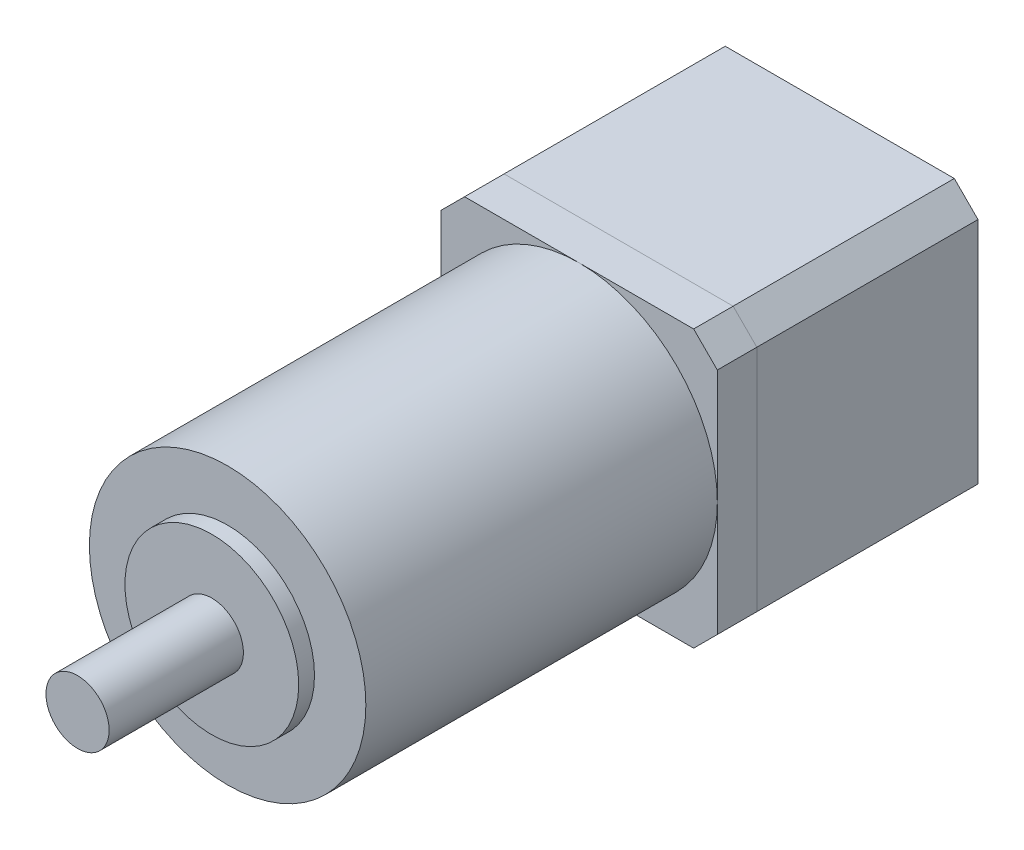
ISO-10303-21;
HEADER;
FILE_DESCRIPTION(('STEP AP214'),'2;1');
FILE_NAME('part.step','',(''),(''),'','','');
FILE_SCHEMA(('AUTOMOTIVE_DESIGN { 1 0 10303 214 1 1 1 1 }'));
ENDSEC;
DATA;
#1=APPLICATION_CONTEXT('core data for automotive mechanical design processes');
#2=APPLICATION_PROTOCOL_DEFINITION('international standard','automotive_design',2000,#1);
#3=PRODUCT_CONTEXT('',#1,'mechanical');
#4=PRODUCT('Part','Part','',(#3));
#5=PRODUCT_RELATED_PRODUCT_CATEGORY('part','',(#4));
#6=PRODUCT_DEFINITION_FORMATION('','',#4);
#7=PRODUCT_DEFINITION_CONTEXT('part definition',#1,'design');
#8=PRODUCT_DEFINITION('design','',#6,#7);
#9=PRODUCT_DEFINITION_SHAPE('','',#8);
#10=(LENGTH_UNIT() NAMED_UNIT(*) SI_UNIT(.MILLI.,.METRE.));
#11=(NAMED_UNIT(*) PLANE_ANGLE_UNIT() SI_UNIT($,.RADIAN.));
#12=(NAMED_UNIT(*) SI_UNIT($,.STERADIAN.) SOLID_ANGLE_UNIT());
#13=UNCERTAINTY_MEASURE_WITH_UNIT(LENGTH_MEASURE(1.E-05),#10,'distance_accuracy_value','');
#14=(GEOMETRIC_REPRESENTATION_CONTEXT(3) GLOBAL_UNCERTAINTY_ASSIGNED_CONTEXT((#13)) GLOBAL_UNIT_ASSIGNED_CONTEXT((#10,
#11,#12)) REPRESENTATION_CONTEXT('',''));
#15=CARTESIAN_POINT('',(0.,0.,0.));
#16=DIRECTION('',(0.,0.,1.));
#17=DIRECTION('',(1.,0.,0.));
#18=AXIS2_PLACEMENT_3D('',#15,#16,#17);
#19=CARTESIAN_POINT('',(0.,0.,96.5));
#20=DIRECTION('',(0.,0.,-1.));
#21=DIRECTION('',(-1.,0.,0.));
#22=AXIS2_PLACEMENT_3D('',#19,#20,#21);
#23=CYLINDRICAL_SURFACE('',#22,4.);
#24=CARTESIAN_POINT('',(0.,0.,96.5));
#25=DIRECTION('',(0.,0.,1.));
#26=DIRECTION('',(1.,0.,0.));
#27=AXIS2_PLACEMENT_3D('',#24,#25,#26);
#28=CIRCLE('',#27,4.);
#29=CARTESIAN_POINT('',(4.,0.,96.5));
#30=VERTEX_POINT('',#29);
#31=EDGE_CURVE('E11',#30,#30,#28,.T.);
#32=ORIENTED_EDGE('',*,*,#31,.F.);
#33=EDGE_LOOP('',(#32));
#34=FACE_BOUND('',#33,.T.);
#35=CARTESIAN_POINT('',(0.,0.,79.5));
#36=DIRECTION('',(0.,0.,1.));
#37=DIRECTION('',(1.,0.,0.));
#38=AXIS2_PLACEMENT_3D('',#35,#36,#37);
#39=CIRCLE('',#38,4.);
#40=CARTESIAN_POINT('',(4.,0.,79.5));
#41=VERTEX_POINT('',#40);
#42=EDGE_CURVE('E48',#41,#41,#39,.T.);
#43=ORIENTED_EDGE('',*,*,#42,.T.);
#44=EDGE_LOOP('',(#43));
#45=FACE_BOUND('',#44,.T.);
#46=ADVANCED_FACE('F45',(#34,#45),#23,.T.);
#47=CARTESIAN_POINT('',(0.,0.,96.5));
#48=DIRECTION('',(0.,0.,1.));
#49=DIRECTION('',(1.,0.,0.));
#50=AXIS2_PLACEMENT_3D('',#47,#48,#49);
#51=PLANE('',#50);
#52=ORIENTED_EDGE('',*,*,#31,.T.);
#53=EDGE_LOOP('',(#52));
#54=FACE_BOUND('',#53,.T.);
#55=ADVANCED_FACE('F60',(#54),#51,.T.);
#56=CARTESIAN_POINT('',(0.,0.,79.5));
#57=DIRECTION('',(0.,0.,1.));
#58=DIRECTION('',(1.,0.,0.));
#59=AXIS2_PLACEMENT_3D('',#56,#57,#58);
#60=PLANE('',#59);
#61=ORIENTED_EDGE('',*,*,#42,.F.);
#62=EDGE_LOOP('',(#61));
#63=FACE_BOUND('',#62,.T.);
#64=ADVANCED_FACE('F58',(#63),#60,.F.);
#65=CLOSED_SHELL('',(#46,#55,#64));
#66=MANIFOLD_SOLID_BREP('B2',#65);
#67=CARTESIAN_POINT('',(0.,0.,77.5));
#68=DIRECTION('',(0.,0.,-1.));
#69=DIRECTION('',(-1.,0.,0.));
#70=AXIS2_PLACEMENT_3D('',#67,#68,#69);
#71=CYLINDRICAL_SURFACE('',#70,17.5);
#72=CARTESIAN_POINT('',(0.,0.,77.5));
#73=DIRECTION('',(0.,0.,1.));
#74=DIRECTION('',(1.,0.,0.));
#75=AXIS2_PLACEMENT_3D('',#72,#73,#74);
#76=CIRCLE('',#75,17.5);
#77=CARTESIAN_POINT('',(17.5,0.,77.5));
#78=VERTEX_POINT('',#77);
#79=EDGE_CURVE('E102',#78,#78,#76,.T.);
#80=ORIENTED_EDGE('',*,*,#79,.F.);
#81=EDGE_LOOP('',(#80));
#82=FACE_BOUND('',#81,.T.);
#83=CARTESIAN_POINT('',(0.,0.,33.));
#84=DIRECTION('',(0.,0.,1.));
#85=DIRECTION('',(1.,0.,0.));
#86=AXIS2_PLACEMENT_3D('',#83,#84,#85);
#87=CIRCLE('',#86,17.5);
#88=CARTESIAN_POINT('',(17.5,0.,33.));
#89=VERTEX_POINT('',#88);
#90=EDGE_CURVE('E98',#89,#89,#87,.T.);
#91=ORIENTED_EDGE('',*,*,#90,.T.);
#92=EDGE_LOOP('',(#91));
#93=FACE_BOUND('',#92,.T.);
#94=ADVANCED_FACE('F95',(#82,#93),#71,.T.);
#95=CARTESIAN_POINT('',(0.,0.,77.5));
#96=DIRECTION('',(0.,0.,1.));
#97=DIRECTION('',(1.,0.,0.));
#98=AXIS2_PLACEMENT_3D('',#95,#96,#97);
#99=PLANE('',#98);
#100=CARTESIAN_POINT('',(0.,0.,77.5));
#101=DIRECTION('',(0.,0.,1.));
#102=DIRECTION('',(1.,0.,0.));
#103=AXIS2_PLACEMENT_3D('',#100,#101,#102);
#104=CIRCLE('',#103,11.);
#105=CARTESIAN_POINT('',(11.,0.,77.5));
#106=VERTEX_POINT('',#105);
#107=EDGE_CURVE('E44',#106,#106,#104,.T.);
#108=ORIENTED_EDGE('',*,*,#107,.F.);
#109=EDGE_LOOP('',(#108));
#110=FACE_BOUND('',#109,.T.);
#111=ORIENTED_EDGE('',*,*,#79,.T.);
#112=EDGE_LOOP('',(#111));
#113=FACE_BOUND('',#112,.T.);
#114=ADVANCED_FACE('F119',(#110,#113),#99,.T.);
#115=CARTESIAN_POINT('',(0.,0.,33.));
#116=DIRECTION('',(0.,0.,1.));
#117=DIRECTION('',(1.,0.,0.));
#118=AXIS2_PLACEMENT_3D('',#115,#116,#117);
#119=PLANE('',#118);
#120=ORIENTED_EDGE('',*,*,#90,.F.);
#121=EDGE_LOOP('',(#120));
#122=FACE_BOUND('',#121,.T.);
#123=ADVANCED_FACE('F116',(#122),#119,.F.);
#124=CARTESIAN_POINT('',(0.,0.,79.5));
#125=DIRECTION('',(0.,0.,-1.));
#126=DIRECTION('',(-1.,0.,0.));
#127=AXIS2_PLACEMENT_3D('',#124,#125,#126);
#128=CYLINDRICAL_SURFACE('',#127,11.);
#129=CARTESIAN_POINT('',(0.,0.,79.5));
#130=DIRECTION('',(0.,0.,1.));
#131=DIRECTION('',(1.,0.,0.));
#132=AXIS2_PLACEMENT_3D('',#129,#130,#131);
#133=CIRCLE('',#132,11.);
#134=CARTESIAN_POINT('',(11.,0.,79.5));
#135=VERTEX_POINT('',#134);
#136=EDGE_CURVE('E108',#135,#135,#133,.T.);
#137=ORIENTED_EDGE('',*,*,#136,.F.);
#138=EDGE_LOOP('',(#137));
#139=FACE_BOUND('',#138,.T.);
#140=ORIENTED_EDGE('',*,*,#107,.T.);
#141=EDGE_LOOP('',(#140));
#142=FACE_BOUND('',#141,.T.);
#143=ADVANCED_FACE('F118',(#139,#142),#128,.T.);
#144=CARTESIAN_POINT('',(0.,0.,79.5));
#145=DIRECTION('',(0.,0.,1.));
#146=DIRECTION('',(1.,0.,0.));
#147=AXIS2_PLACEMENT_3D('',#144,#145,#146);
#148=PLANE('',#147);
#149=ORIENTED_EDGE('',*,*,#136,.T.);
#150=EDGE_LOOP('',(#149));
#151=FACE_BOUND('',#150,.T.);
#152=ADVANCED_FACE('F124',(#151),#148,.T.);
#153=CLOSED_SHELL('',(#94,#114,#123,#143,#152));
#154=MANIFOLD_SOLID_BREP('B6',#153);
#155=CARTESIAN_POINT('',(-17.5,-14.5,33.));
#156=DIRECTION('',(0.707106781186548,0.707106781186547,0.));
#157=DIRECTION('',(-0.707106781186547,0.707106781186548,0.));
#158=AXIS2_PLACEMENT_3D('',#155,#156,#157);
#159=PLANE('',#158);
#160=DIRECTION('',(0.707106781186547,-0.707106781186548,0.));
#161=VECTOR('',#160,1.);
#162=CARTESIAN_POINT('',(-17.5,-14.5,28.));
#163=LINE('',#162,#161);
#164=CARTESIAN_POINT('',(-17.5,-14.5,28.));
#165=VERTEX_POINT('',#164);
#166=CARTESIAN_POINT('',(-14.5,-17.5,28.));
#167=VERTEX_POINT('',#166);
#168=EDGE_CURVE('E270',#165,#167,#163,.T.);
#169=ORIENTED_EDGE('',*,*,#168,.T.);
#170=DIRECTION('',(0.,0.,-1.));
#171=VECTOR('',#170,1.);
#172=CARTESIAN_POINT('',(-14.5,-17.5,33.));
#173=LINE('',#172,#171);
#174=CARTESIAN_POINT('',(-14.5,-17.5,33.));
#175=VERTEX_POINT('',#174);
#176=EDGE_CURVE('E93',#175,#167,#173,.T.);
#177=ORIENTED_EDGE('',*,*,#176,.F.);
#178=DIRECTION('',(0.707106781186547,-0.707106781186548,0.));
#179=VECTOR('',#178,1.);
#180=CARTESIAN_POINT('',(-17.5,-14.5,33.));
#181=LINE('',#180,#179);
#182=CARTESIAN_POINT('',(-17.5,-14.5,33.));
#183=VERTEX_POINT('',#182);
#184=EDGE_CURVE('E284',#183,#175,#181,.T.);
#185=ORIENTED_EDGE('',*,*,#184,.F.);
#186=DIRECTION('',(0.,0.,-1.));
#187=VECTOR('',#186,1.);
#188=CARTESIAN_POINT('',(-17.5,-14.5,33.));
#189=LINE('',#188,#187);
#190=EDGE_CURVE('E266',#183,#165,#189,.T.);
#191=ORIENTED_EDGE('',*,*,#190,.T.);
#192=EDGE_LOOP('',(#169,#177,#185,#191));
#193=FACE_BOUND('',#192,.T.);
#194=ADVANCED_FACE('F174',(#193),#159,.F.);
#195=CARTESIAN_POINT('',(-14.5,-17.5,33.));
#196=DIRECTION('',(0.,1.,0.));
#197=DIRECTION('',(0.,0.,1.));
#198=AXIS2_PLACEMENT_3D('',#195,#196,#197);
#199=PLANE('',#198);
#200=DIRECTION('',(1.,0.,0.));
#201=VECTOR('',#200,1.);
#202=CARTESIAN_POINT('',(-14.5,-17.5,28.));
#203=LINE('',#202,#201);
#204=CARTESIAN_POINT('',(14.5,-17.5,28.));
#205=VERTEX_POINT('',#204);
#206=EDGE_CURVE('E273',#167,#205,#203,.T.);
#207=ORIENTED_EDGE('',*,*,#206,.T.);
#208=DIRECTION('',(0.,0.,-1.));
#209=VECTOR('',#208,1.);
#210=CARTESIAN_POINT('',(14.5,-17.5,33.));
#211=LINE('',#210,#209);
#212=CARTESIAN_POINT('',(14.5,-17.5,33.));
#213=VERTEX_POINT('',#212);
#214=EDGE_CURVE('E182',#213,#205,#211,.T.);
#215=ORIENTED_EDGE('',*,*,#214,.F.);
#216=DIRECTION('',(1.,0.,0.));
#217=VECTOR('',#216,1.);
#218=CARTESIAN_POINT('',(-14.5,-17.5,33.));
#219=LINE('',#218,#217);
#220=EDGE_CURVE('E233',#175,#213,#219,.T.);
#221=ORIENTED_EDGE('',*,*,#220,.F.);
#222=ORIENTED_EDGE('',*,*,#176,.T.);
#223=EDGE_LOOP('',(#207,#215,#221,#222));
#224=FACE_BOUND('',#223,.T.);
#225=ADVANCED_FACE('F319',(#224),#199,.F.);
#226=CARTESIAN_POINT('',(14.5,-17.5,33.));
#227=DIRECTION('',(-0.707106781186546,0.707106781186549,0.));
#228=DIRECTION('',(-0.707106781186549,-0.707106781186546,0.));
#229=AXIS2_PLACEMENT_3D('',#226,#227,#228);
#230=PLANE('',#229);
#231=DIRECTION('',(0.707106781186549,0.707106781186546,0.));
#232=VECTOR('',#231,1.);
#233=CARTESIAN_POINT('',(14.5,-17.5,28.));
#234=LINE('',#233,#232);
#235=CARTESIAN_POINT('',(17.5,-14.5,28.));
#236=VERTEX_POINT('',#235);
#237=EDGE_CURVE('E275',#205,#236,#234,.T.);
#238=ORIENTED_EDGE('',*,*,#237,.T.);
#239=DIRECTION('',(0.,0.,-1.));
#240=VECTOR('',#239,1.);
#241=CARTESIAN_POINT('',(17.5,-14.5,33.));
#242=LINE('',#241,#240);
#243=CARTESIAN_POINT('',(17.5,-14.5,33.));
#244=VERTEX_POINT('',#243);
#245=EDGE_CURVE('E291',#244,#236,#242,.T.);
#246=ORIENTED_EDGE('',*,*,#245,.F.);
#247=DIRECTION('',(0.707106781186549,0.707106781186546,0.));
#248=VECTOR('',#247,1.);
#249=CARTESIAN_POINT('',(14.5,-17.5,33.));
#250=LINE('',#249,#248);
#251=EDGE_CURVE('E299',#213,#244,#250,.T.);
#252=ORIENTED_EDGE('',*,*,#251,.F.);
#253=ORIENTED_EDGE('',*,*,#214,.T.);
#254=EDGE_LOOP('',(#238,#246,#252,#253));
#255=FACE_BOUND('',#254,.T.);
#256=ADVANCED_FACE('F297',(#255),#230,.F.);
#257=CARTESIAN_POINT('',(17.5,-14.5,33.));
#258=DIRECTION('',(-1.,0.,0.));
#259=DIRECTION('',(0.,-1.,0.));
#260=AXIS2_PLACEMENT_3D('',#257,#258,#259);
#261=PLANE('',#260);
#262=DIRECTION('',(0.,1.,0.));
#263=VECTOR('',#262,1.);
#264=CARTESIAN_POINT('',(17.5,-14.5,28.));
#265=LINE('',#264,#263);
#266=CARTESIAN_POINT('',(17.5,14.5,28.));
#267=VERTEX_POINT('',#266);
#268=EDGE_CURVE('E277',#236,#267,#265,.T.);
#269=ORIENTED_EDGE('',*,*,#268,.T.);
#270=DIRECTION('',(0.,0.,-1.));
#271=VECTOR('',#270,1.);
#272=CARTESIAN_POINT('',(17.5,14.5,33.));
#273=LINE('',#272,#271);
#274=CARTESIAN_POINT('',(17.5,14.5,33.));
#275=VERTEX_POINT('',#274);
#276=EDGE_CURVE('E288',#275,#267,#273,.T.);
#277=ORIENTED_EDGE('',*,*,#276,.F.);
#278=DIRECTION('',(0.,1.,0.));
#279=VECTOR('',#278,1.);
#280=CARTESIAN_POINT('',(17.5,-14.5,33.));
#281=LINE('',#280,#279);
#282=EDGE_CURVE('E311',#244,#275,#281,.T.);
#283=ORIENTED_EDGE('',*,*,#282,.F.);
#284=ORIENTED_EDGE('',*,*,#245,.T.);
#285=EDGE_LOOP('',(#269,#277,#283,#284));
#286=FACE_BOUND('',#285,.T.);
#287=ADVANCED_FACE('F307',(#286),#261,.F.);
#288=CARTESIAN_POINT('',(17.5,14.5,33.));
#289=DIRECTION('',(-0.707106781186548,-0.707106781186547,0.));
#290=DIRECTION('',(0.707106781186547,-0.707106781186548,0.));
#291=AXIS2_PLACEMENT_3D('',#288,#289,#290);
#292=PLANE('',#291);
#293=DIRECTION('',(-0.707106781186547,0.707106781186548,0.));
#294=VECTOR('',#293,1.);
#295=CARTESIAN_POINT('',(17.5,14.5,28.));
#296=LINE('',#295,#294);
#297=CARTESIAN_POINT('',(14.5,17.5,28.));
#298=VERTEX_POINT('',#297);
#299=EDGE_CURVE('E279',#267,#298,#296,.T.);
#300=ORIENTED_EDGE('',*,*,#299,.T.);
#301=DIRECTION('',(0.,0.,-1.));
#302=VECTOR('',#301,1.);
#303=CARTESIAN_POINT('',(14.5,17.5,33.));
#304=LINE('',#303,#302);
#305=CARTESIAN_POINT('',(14.5,17.5,33.));
#306=VERTEX_POINT('',#305);
#307=EDGE_CURVE('E261',#306,#298,#304,.T.);
#308=ORIENTED_EDGE('',*,*,#307,.F.);
#309=DIRECTION('',(-0.707106781186547,0.707106781186548,0.));
#310=VECTOR('',#309,1.);
#311=CARTESIAN_POINT('',(17.5,14.5,33.));
#312=LINE('',#311,#310);
#313=EDGE_CURVE('E252',#275,#306,#312,.T.);
#314=ORIENTED_EDGE('',*,*,#313,.F.);
#315=ORIENTED_EDGE('',*,*,#276,.T.);
#316=EDGE_LOOP('',(#300,#308,#314,#315));
#317=FACE_BOUND('',#316,.T.);
#318=ADVANCED_FACE('F310',(#317),#292,.F.);
#319=CARTESIAN_POINT('',(14.5,17.5,33.));
#320=DIRECTION('',(0.,-1.,0.));
#321=DIRECTION('',(0.,0.,-1.));
#322=AXIS2_PLACEMENT_3D('',#319,#320,#321);
#323=PLANE('',#322);
#324=DIRECTION('',(-1.,0.,0.));
#325=VECTOR('',#324,1.);
#326=CARTESIAN_POINT('',(14.5,17.5,28.));
#327=LINE('',#326,#325);
#328=CARTESIAN_POINT('',(-14.5,17.5,28.));
#329=VERTEX_POINT('',#328);
#330=EDGE_CURVE('E260',#298,#329,#327,.T.);
#331=ORIENTED_EDGE('',*,*,#330,.T.);
#332=DIRECTION('',(0.,0.,-1.));
#333=VECTOR('',#332,1.);
#334=CARTESIAN_POINT('',(-14.5,17.5,33.));
#335=LINE('',#334,#333);
#336=CARTESIAN_POINT('',(-14.5,17.5,33.));
#337=VERTEX_POINT('',#336);
#338=EDGE_CURVE('E257',#337,#329,#335,.T.);
#339=ORIENTED_EDGE('',*,*,#338,.F.);
#340=DIRECTION('',(-1.,0.,0.));
#341=VECTOR('',#340,1.);
#342=CARTESIAN_POINT('',(14.5,17.5,33.));
#343=LINE('',#342,#341);
#344=EDGE_CURVE('E246',#306,#337,#343,.T.);
#345=ORIENTED_EDGE('',*,*,#344,.F.);
#346=ORIENTED_EDGE('',*,*,#307,.T.);
#347=EDGE_LOOP('',(#331,#339,#345,#346));
#348=FACE_BOUND('',#347,.T.);
#349=ADVANCED_FACE('F258',(#348),#323,.F.);
#350=CARTESIAN_POINT('',(-14.5,17.5,33.));
#351=DIRECTION('',(0.707106781186547,-0.707106781186548,0.));
#352=DIRECTION('',(0.707106781186548,0.707106781186547,0.));
#353=AXIS2_PLACEMENT_3D('',#350,#351,#352);
#354=PLANE('',#353);
#355=DIRECTION('',(-0.707106781186548,-0.707106781186547,0.));
#356=VECTOR('',#355,1.);
#357=CARTESIAN_POINT('',(-14.5,17.5,28.));
#358=LINE('',#357,#356);
#359=CARTESIAN_POINT('',(-17.5,14.5,28.));
#360=VERTEX_POINT('',#359);
#361=EDGE_CURVE('E219',#329,#360,#358,.T.);
#362=ORIENTED_EDGE('',*,*,#361,.T.);
#363=DIRECTION('',(0.,0.,-1.));
#364=VECTOR('',#363,1.);
#365=CARTESIAN_POINT('',(-17.5,14.5,33.));
#366=LINE('',#365,#364);
#367=CARTESIAN_POINT('',(-17.5,14.5,33.));
#368=VERTEX_POINT('',#367);
#369=EDGE_CURVE('E262',#368,#360,#366,.T.);
#370=ORIENTED_EDGE('',*,*,#369,.F.);
#371=DIRECTION('',(-0.707106781186548,-0.707106781186547,0.));
#372=VECTOR('',#371,1.);
#373=CARTESIAN_POINT('',(-14.5,17.5,33.));
#374=LINE('',#373,#372);
#375=EDGE_CURVE('E250',#337,#368,#374,.T.);
#376=ORIENTED_EDGE('',*,*,#375,.F.);
#377=ORIENTED_EDGE('',*,*,#338,.T.);
#378=EDGE_LOOP('',(#362,#370,#376,#377));
#379=FACE_BOUND('',#378,.T.);
#380=ADVANCED_FACE('F264',(#379),#354,.F.);
#381=CARTESIAN_POINT('',(-17.5,14.5,33.));
#382=DIRECTION('',(1.,0.,0.));
#383=DIRECTION('',(0.,1.,0.));
#384=AXIS2_PLACEMENT_3D('',#381,#382,#383);
#385=PLANE('',#384);
#386=DIRECTION('',(0.,-1.,0.));
#387=VECTOR('',#386,1.);
#388=CARTESIAN_POINT('',(-17.5,14.5,28.));
#389=LINE('',#388,#387);
#390=EDGE_CURVE('E225',#360,#165,#389,.T.);
#391=ORIENTED_EDGE('',*,*,#390,.T.);
#392=ORIENTED_EDGE('',*,*,#190,.F.);
#393=DIRECTION('',(0.,-1.,0.));
#394=VECTOR('',#393,1.);
#395=CARTESIAN_POINT('',(-17.5,14.5,33.));
#396=LINE('',#395,#394);
#397=EDGE_CURVE('E190',#368,#183,#396,.T.);
#398=ORIENTED_EDGE('',*,*,#397,.F.);
#399=ORIENTED_EDGE('',*,*,#369,.T.);
#400=EDGE_LOOP('',(#391,#392,#398,#399));
#401=FACE_BOUND('',#400,.T.);
#402=ADVANCED_FACE('F335',(#401),#385,.F.);
#403=CARTESIAN_POINT('',(0.,0.,33.));
#404=DIRECTION('',(0.,0.,1.));
#405=DIRECTION('',(1.,0.,0.));
#406=AXIS2_PLACEMENT_3D('',#403,#404,#405);
#407=PLANE('',#406);
#408=ORIENTED_EDGE('',*,*,#184,.T.);
#409=ORIENTED_EDGE('',*,*,#220,.T.);
#410=ORIENTED_EDGE('',*,*,#251,.T.);
#411=ORIENTED_EDGE('',*,*,#282,.T.);
#412=ORIENTED_EDGE('',*,*,#313,.T.);
#413=ORIENTED_EDGE('',*,*,#344,.T.);
#414=ORIENTED_EDGE('',*,*,#375,.T.);
#415=ORIENTED_EDGE('',*,*,#397,.T.);
#416=EDGE_LOOP('',(#408,#409,#410,#411,#412,#413,#414,#415));
#417=FACE_BOUND('',#416,.T.);
#418=ADVANCED_FACE('F248',(#417),#407,.T.);
#419=CARTESIAN_POINT('',(0.,0.,28.));
#420=DIRECTION('',(0.,0.,1.));
#421=DIRECTION('',(1.,0.,0.));
#422=AXIS2_PLACEMENT_3D('',#419,#420,#421);
#423=PLANE('',#422);
#424=ORIENTED_EDGE('',*,*,#168,.F.);
#425=ORIENTED_EDGE('',*,*,#390,.F.);
#426=ORIENTED_EDGE('',*,*,#361,.F.);
#427=ORIENTED_EDGE('',*,*,#330,.F.);
#428=ORIENTED_EDGE('',*,*,#299,.F.);
#429=ORIENTED_EDGE('',*,*,#268,.F.);
#430=ORIENTED_EDGE('',*,*,#237,.F.);
#431=ORIENTED_EDGE('',*,*,#206,.F.);
#432=EDGE_LOOP('',(#424,#425,#426,#427,#428,#429,#430,#431));
#433=FACE_BOUND('',#432,.T.);
#434=ADVANCED_FACE('F303',(#433),#423,.F.);
#435=CLOSED_SHELL('',(#194,#225,#256,#287,#318,#349,#380,#402,#418,#434));
#436=MANIFOLD_SOLID_BREP('B39',#435);
#437=CARTESIAN_POINT('',(17.5,17.5,28.));
#438=DIRECTION('',(-1.,0.,0.));
#439=DIRECTION('',(0.,-1.,0.));
#440=AXIS2_PLACEMENT_3D('',#437,#438,#439);
#441=PLANE('',#440);
#442=DIRECTION('',(0.,1.,0.));
#443=VECTOR('',#442,1.);
#444=CARTESIAN_POINT('',(17.5,17.5,28.));
#445=LINE('',#444,#443);
#446=CARTESIAN_POINT('',(17.5,-14.5,28.));
#447=VERTEX_POINT('',#446);
#448=CARTESIAN_POINT('',(17.5,14.5,28.));
#449=VERTEX_POINT('',#448);
#450=EDGE_CURVE('E488',#447,#449,#445,.T.);
#451=ORIENTED_EDGE('',*,*,#450,.F.);
#452=DIRECTION('',(0.,0.,-1.));
#453=VECTOR('',#452,1.);
#454=CARTESIAN_POINT('',(17.5,-14.5,28.));
#455=LINE('',#454,#453);
#456=CARTESIAN_POINT('',(17.5,-14.5,0.));
#457=VERTEX_POINT('',#456);
#458=EDGE_CURVE('E473',#447,#457,#455,.T.);
#459=ORIENTED_EDGE('',*,*,#458,.T.);
#460=DIRECTION('',(0.,1.,0.));
#461=VECTOR('',#460,1.);
#462=CARTESIAN_POINT('',(17.5,17.5,0.));
#463=LINE('',#462,#461);
#464=CARTESIAN_POINT('',(17.5,14.5,0.));
#465=VERTEX_POINT('',#464);
#466=EDGE_CURVE('E485',#457,#465,#463,.T.);
#467=ORIENTED_EDGE('',*,*,#466,.T.);
#468=DIRECTION('',(0.,0.,1.));
#469=VECTOR('',#468,1.);
#470=CARTESIAN_POINT('',(17.5,14.5,28.));
#471=LINE('',#470,#469);
#472=EDGE_CURVE('E490',#465,#449,#471,.T.);
#473=ORIENTED_EDGE('',*,*,#472,.T.);
#474=EDGE_LOOP('',(#451,#459,#467,#473));
#475=FACE_BOUND('',#474,.T.);
#476=ADVANCED_FACE('F401',(#475),#441,.F.);
#477=CARTESIAN_POINT('',(-17.5,17.5,28.));
#478=DIRECTION('',(0.,-1.,0.));
#479=DIRECTION('',(0.,0.,-1.));
#480=AXIS2_PLACEMENT_3D('',#477,#478,#479);
#481=PLANE('',#480);
#482=DIRECTION('',(-1.,0.,0.));
#483=VECTOR('',#482,1.);
#484=CARTESIAN_POINT('',(-17.5,17.5,28.));
#485=LINE('',#484,#483);
#486=CARTESIAN_POINT('',(14.5,17.5,28.));
#487=VERTEX_POINT('',#486);
#488=CARTESIAN_POINT('',(-14.5,17.5,28.));
#489=VERTEX_POINT('',#488);
#490=EDGE_CURVE('E528',#487,#489,#485,.T.);
#491=ORIENTED_EDGE('',*,*,#490,.F.);
#492=DIRECTION('',(0.,0.,-1.));
#493=VECTOR('',#492,1.);
#494=CARTESIAN_POINT('',(14.5,17.5,28.));
#495=LINE('',#494,#493);
#496=CARTESIAN_POINT('',(14.5,17.5,0.));
#497=VERTEX_POINT('',#496);
#498=EDGE_CURVE('E172',#487,#497,#495,.T.);
#499=ORIENTED_EDGE('',*,*,#498,.T.);
#500=DIRECTION('',(-1.,0.,0.));
#501=VECTOR('',#500,1.);
#502=CARTESIAN_POINT('',(-17.5,17.5,0.));
#503=LINE('',#502,#501);
#504=CARTESIAN_POINT('',(-14.5,17.5,0.));
#505=VERTEX_POINT('',#504);
#506=EDGE_CURVE('E495',#497,#505,#503,.T.);
#507=ORIENTED_EDGE('',*,*,#506,.T.);
#508=DIRECTION('',(0.,0.,1.));
#509=VECTOR('',#508,1.);
#510=CARTESIAN_POINT('',(-14.5,17.5,28.));
#511=LINE('',#510,#509);
#512=EDGE_CURVE('E410',#505,#489,#511,.T.);
#513=ORIENTED_EDGE('',*,*,#512,.T.);
#514=EDGE_LOOP('',(#491,#499,#507,#513));
#515=FACE_BOUND('',#514,.T.);
#516=ADVANCED_FACE('F527',(#515),#481,.F.);
#517=CARTESIAN_POINT('',(-17.5,17.5,28.));
#518=DIRECTION('',(1.,0.,0.));
#519=DIRECTION('',(0.,1.,0.));
#520=AXIS2_PLACEMENT_3D('',#517,#518,#519);
#521=PLANE('',#520);
#522=DIRECTION('',(0.,-1.,0.));
#523=VECTOR('',#522,1.);
#524=CARTESIAN_POINT('',(-17.5,17.5,0.));
#525=LINE('',#524,#523);
#526=CARTESIAN_POINT('',(-17.5,14.5,0.));
#527=VERTEX_POINT('',#526);
#528=CARTESIAN_POINT('',(-17.5,-14.5,0.));
#529=VERTEX_POINT('',#528);
#530=EDGE_CURVE('E498',#527,#529,#525,.T.);
#531=ORIENTED_EDGE('',*,*,#530,.T.);
#532=DIRECTION('',(0.,0.,1.));
#533=VECTOR('',#532,1.);
#534=CARTESIAN_POINT('',(-17.5,-14.5,28.));
#535=LINE('',#534,#533);
#536=CARTESIAN_POINT('',(-17.5,-14.5,28.));
#537=VERTEX_POINT('',#536);
#538=EDGE_CURVE('E417',#529,#537,#535,.T.);
#539=ORIENTED_EDGE('',*,*,#538,.T.);
#540=DIRECTION('',(0.,-1.,0.));
#541=VECTOR('',#540,1.);
#542=CARTESIAN_POINT('',(-17.5,17.5,28.));
#543=LINE('',#542,#541);
#544=CARTESIAN_POINT('',(-17.5,14.5,28.));
#545=VERTEX_POINT('',#544);
#546=EDGE_CURVE('E534',#545,#537,#543,.T.);
#547=ORIENTED_EDGE('',*,*,#546,.F.);
#548=DIRECTION('',(0.,0.,-1.));
#549=VECTOR('',#548,1.);
#550=CARTESIAN_POINT('',(-17.5,14.5,28.));
#551=LINE('',#550,#549);
#552=EDGE_CURVE('E521',#545,#527,#551,.T.);
#553=ORIENTED_EDGE('',*,*,#552,.T.);
#554=EDGE_LOOP('',(#531,#539,#547,#553));
#555=FACE_BOUND('',#554,.T.);
#556=ADVANCED_FACE('F538',(#555),#521,.F.);
#557=CARTESIAN_POINT('',(-17.5,-17.5,28.));
#558=DIRECTION('',(0.,1.,0.));
#559=DIRECTION('',(0.,0.,1.));
#560=AXIS2_PLACEMENT_3D('',#557,#558,#559);
#561=PLANE('',#560);
#562=DIRECTION('',(1.,0.,0.));
#563=VECTOR('',#562,1.);
#564=CARTESIAN_POINT('',(-17.5,-17.5,0.));
#565=LINE('',#564,#563);
#566=CARTESIAN_POINT('',(-14.5,-17.5,0.));
#567=VERTEX_POINT('',#566);
#568=CARTESIAN_POINT('',(14.5,-17.5,0.));
#569=VERTEX_POINT('',#568);
#570=EDGE_CURVE('E505',#567,#569,#565,.T.);
#571=ORIENTED_EDGE('',*,*,#570,.T.);
#572=DIRECTION('',(0.,0.,1.));
#573=VECTOR('',#572,1.);
#574=CARTESIAN_POINT('',(14.5,-17.5,28.));
#575=LINE('',#574,#573);
#576=CARTESIAN_POINT('',(14.5,-17.5,28.));
#577=VERTEX_POINT('',#576);
#578=EDGE_CURVE('E474',#569,#577,#575,.T.);
#579=ORIENTED_EDGE('',*,*,#578,.T.);
#580=DIRECTION('',(1.,0.,0.));
#581=VECTOR('',#580,1.);
#582=CARTESIAN_POINT('',(-17.5,-17.5,28.));
#583=LINE('',#582,#581);
#584=CARTESIAN_POINT('',(-14.5,-17.5,28.));
#585=VERTEX_POINT('',#584);
#586=EDGE_CURVE('E501',#585,#577,#583,.T.);
#587=ORIENTED_EDGE('',*,*,#586,.F.);
#588=DIRECTION('',(0.,0.,-1.));
#589=VECTOR('',#588,1.);
#590=CARTESIAN_POINT('',(-14.5,-17.5,28.));
#591=LINE('',#590,#589);
#592=EDGE_CURVE('E479',#585,#567,#591,.T.);
#593=ORIENTED_EDGE('',*,*,#592,.T.);
#594=EDGE_LOOP('',(#571,#579,#587,#593));
#595=FACE_BOUND('',#594,.T.);
#596=ADVANCED_FACE('F545',(#595),#561,.F.);
#597=CARTESIAN_POINT('',(0.,0.,28.));
#598=DIRECTION('',(0.,0.,1.));
#599=DIRECTION('',(1.,0.,0.));
#600=AXIS2_PLACEMENT_3D('',#597,#598,#599);
#601=PLANE('',#600);
#602=ORIENTED_EDGE('',*,*,#586,.T.);
#603=DIRECTION('',(-0.707106781186549,-0.707106781186546,0.));
#604=VECTOR('',#603,1.);
#605=CARTESIAN_POINT('',(16.,-16.,28.));
#606=LINE('',#605,#604);
#607=EDGE_CURVE('E519',#577,#447,#606,.F.);
#608=ORIENTED_EDGE('',*,*,#607,.T.);
#609=ORIENTED_EDGE('',*,*,#450,.T.);
#610=DIRECTION('',(0.707106781186547,-0.707106781186548,0.));
#611=VECTOR('',#610,1.);
#612=CARTESIAN_POINT('',(16.,16.,28.));
#613=LINE('',#612,#611);
#614=EDGE_CURVE('E515',#449,#487,#613,.F.);
#615=ORIENTED_EDGE('',*,*,#614,.T.);
#616=ORIENTED_EDGE('',*,*,#490,.T.);
#617=DIRECTION('',(0.707106781186548,0.707106781186547,0.));
#618=VECTOR('',#617,1.);
#619=CARTESIAN_POINT('',(-16.,16.,28.));
#620=LINE('',#619,#618);
#621=EDGE_CURVE('E424',#489,#545,#620,.F.);
#622=ORIENTED_EDGE('',*,*,#621,.T.);
#623=ORIENTED_EDGE('',*,*,#546,.T.);
#624=DIRECTION('',(-0.707106781186547,0.707106781186548,0.));
#625=VECTOR('',#624,1.);
#626=CARTESIAN_POINT('',(-16.,-16.,28.));
#627=LINE('',#626,#625);
#628=EDGE_CURVE('E517',#537,#585,#627,.F.);
#629=ORIENTED_EDGE('',*,*,#628,.T.);
#630=EDGE_LOOP('',(#602,#608,#609,#615,#616,#622,#623,#629));
#631=FACE_BOUND('',#630,.T.);
#632=ADVANCED_FACE('F532',(#631),#601,.T.);
#633=CARTESIAN_POINT('',(0.,0.,0.));
#634=DIRECTION('',(0.,0.,1.));
#635=DIRECTION('',(1.,0.,0.));
#636=AXIS2_PLACEMENT_3D('',#633,#634,#635);
#637=PLANE('',#636);
#638=ORIENTED_EDGE('',*,*,#466,.F.);
#639=DIRECTION('',(0.707106781186549,0.707106781186546,0.));
#640=VECTOR('',#639,1.);
#641=CARTESIAN_POINT('',(17.5,-14.5,0.));
#642=LINE('',#641,#640);
#643=EDGE_CURVE('E469',#457,#569,#642,.F.);
#644=ORIENTED_EDGE('',*,*,#643,.T.);
#645=ORIENTED_EDGE('',*,*,#570,.F.);
#646=DIRECTION('',(0.707106781186547,-0.707106781186548,0.));
#647=VECTOR('',#646,1.);
#648=CARTESIAN_POINT('',(-14.5,-17.5,0.));
#649=LINE('',#648,#647);
#650=EDGE_CURVE('E480',#567,#529,#649,.F.);
#651=ORIENTED_EDGE('',*,*,#650,.T.);
#652=ORIENTED_EDGE('',*,*,#530,.F.);
#653=DIRECTION('',(-0.707106781186548,-0.707106781186547,0.));
#654=VECTOR('',#653,1.);
#655=CARTESIAN_POINT('',(-17.5,14.5,0.));
#656=LINE('',#655,#654);
#657=EDGE_CURVE('E489',#527,#505,#656,.F.);
#658=ORIENTED_EDGE('',*,*,#657,.T.);
#659=ORIENTED_EDGE('',*,*,#506,.F.);
#660=DIRECTION('',(-0.707106781186547,0.707106781186548,0.));
#661=VECTOR('',#660,1.);
#662=CARTESIAN_POINT('',(14.5,17.5,0.));
#663=LINE('',#662,#661);
#664=EDGE_CURVE('E494',#497,#465,#663,.F.);
#665=ORIENTED_EDGE('',*,*,#664,.T.);
#666=EDGE_LOOP('',(#638,#644,#645,#651,#652,#658,#659,#665));
#667=FACE_BOUND('',#666,.T.);
#668=ADVANCED_FACE('F492',(#667),#637,.F.);
#669=CARTESIAN_POINT('',(17.5,-14.5,28.));
#670=DIRECTION('',(-0.707106781186546,0.707106781186549,0.));
#671=DIRECTION('',(0.,0.,-1.));
#672=AXIS2_PLACEMENT_3D('',#669,#670,#671);
#673=PLANE('',#672);
#674=ORIENTED_EDGE('',*,*,#607,.F.);
#675=ORIENTED_EDGE('',*,*,#578,.F.);
#676=ORIENTED_EDGE('',*,*,#643,.F.);
#677=ORIENTED_EDGE('',*,*,#458,.F.);
#678=EDGE_LOOP('',(#674,#675,#676,#677));
#679=FACE_BOUND('',#678,.T.);
#680=ADVANCED_FACE('F472',(#679),#673,.F.);
#681=CARTESIAN_POINT('',(-14.5,-17.5,28.));
#682=DIRECTION('',(0.707106781186548,0.707106781186547,0.));
#683=DIRECTION('',(0.,0.,-1.));
#684=AXIS2_PLACEMENT_3D('',#681,#682,#683);
#685=PLANE('',#684);
#686=ORIENTED_EDGE('',*,*,#628,.F.);
#687=ORIENTED_EDGE('',*,*,#538,.F.);
#688=ORIENTED_EDGE('',*,*,#650,.F.);
#689=ORIENTED_EDGE('',*,*,#592,.F.);
#690=EDGE_LOOP('',(#686,#687,#688,#689));
#691=FACE_BOUND('',#690,.T.);
#692=ADVANCED_FACE('F542',(#691),#685,.F.);
#693=CARTESIAN_POINT('',(14.5,17.5,28.));
#694=DIRECTION('',(-0.707106781186548,-0.707106781186547,0.));
#695=DIRECTION('',(0.,0.,-1.));
#696=AXIS2_PLACEMENT_3D('',#693,#694,#695);
#697=PLANE('',#696);
#698=ORIENTED_EDGE('',*,*,#614,.F.);
#699=ORIENTED_EDGE('',*,*,#472,.F.);
#700=ORIENTED_EDGE('',*,*,#664,.F.);
#701=ORIENTED_EDGE('',*,*,#498,.F.);
#702=EDGE_LOOP('',(#698,#699,#700,#701));
#703=FACE_BOUND('',#702,.T.);
#704=ADVANCED_FACE('F548',(#703),#697,.F.);
#705=CARTESIAN_POINT('',(-17.5,14.5,28.));
#706=DIRECTION('',(0.707106781186547,-0.707106781186548,0.));
#707=DIRECTION('',(0.,0.,-1.));
#708=AXIS2_PLACEMENT_3D('',#705,#706,#707);
#709=PLANE('',#708);
#710=ORIENTED_EDGE('',*,*,#621,.F.);
#711=ORIENTED_EDGE('',*,*,#512,.F.);
#712=ORIENTED_EDGE('',*,*,#657,.F.);
#713=ORIENTED_EDGE('',*,*,#552,.F.);
#714=EDGE_LOOP('',(#710,#711,#712,#713));
#715=FACE_BOUND('',#714,.T.);
#716=ADVANCED_FACE('F404',(#715),#709,.F.);
#717=CLOSED_SHELL('',(#476,#516,#556,#596,#632,#668,#680,#692,#704,#716));
#718=MANIFOLD_SOLID_BREP('B87',#717);
#719=ADVANCED_BREP_SHAPE_REPRESENTATION('',(#18,#66,#154,#436,#718),#14);
#720=SHAPE_DEFINITION_REPRESENTATION(#9,#719);
ENDSEC;
END-ISO-10303-21;
